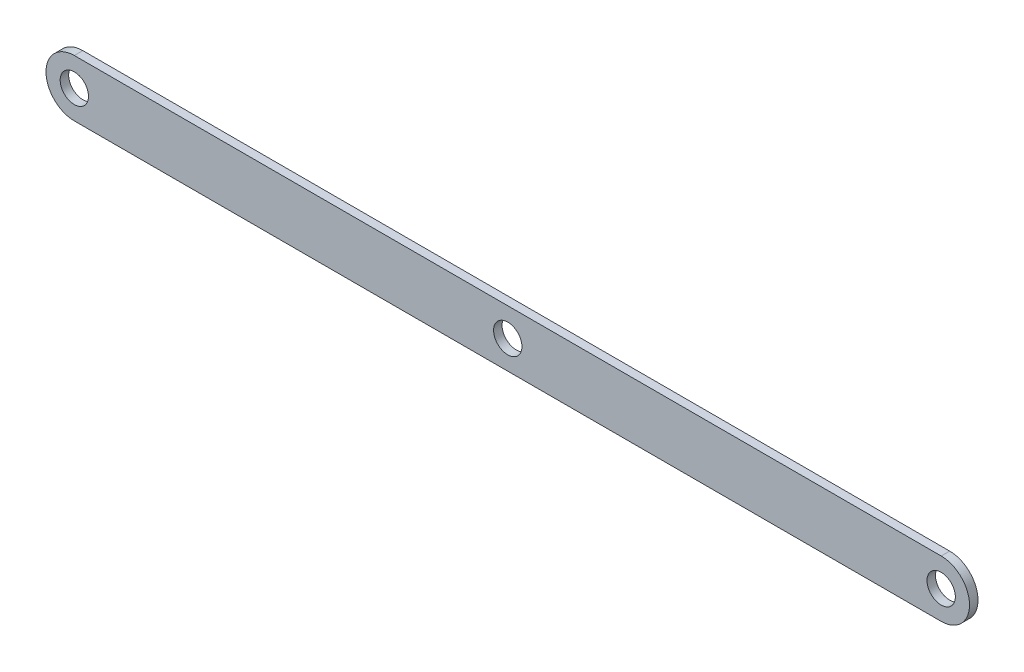
ISO-10303-21;
HEADER;
FILE_DESCRIPTION(('STEP AP214'),'2;1');
FILE_NAME('part.step','',(''),(''),'','','');
FILE_SCHEMA(('AUTOMOTIVE_DESIGN { 1 0 10303 214 1 1 1 1 }'));
ENDSEC;
DATA;
#1=APPLICATION_CONTEXT('core data for automotive mechanical design processes');
#2=APPLICATION_PROTOCOL_DEFINITION('international standard','automotive_design',2000,#1);
#3=PRODUCT_CONTEXT('',#1,'mechanical');
#4=PRODUCT('Part','Part','',(#3));
#5=PRODUCT_RELATED_PRODUCT_CATEGORY('part','',(#4));
#6=PRODUCT_DEFINITION_FORMATION('','',#4);
#7=PRODUCT_DEFINITION_CONTEXT('part definition',#1,'design');
#8=PRODUCT_DEFINITION('design','',#6,#7);
#9=PRODUCT_DEFINITION_SHAPE('','',#8);
#10=(LENGTH_UNIT() NAMED_UNIT(*) SI_UNIT(.MILLI.,.METRE.));
#11=(NAMED_UNIT(*) PLANE_ANGLE_UNIT() SI_UNIT($,.RADIAN.));
#12=(NAMED_UNIT(*) SI_UNIT($,.STERADIAN.) SOLID_ANGLE_UNIT());
#13=UNCERTAINTY_MEASURE_WITH_UNIT(LENGTH_MEASURE(1.E-05),#10,'distance_accuracy_value','');
#14=(GEOMETRIC_REPRESENTATION_CONTEXT(3) GLOBAL_UNCERTAINTY_ASSIGNED_CONTEXT((#13)) GLOBAL_UNIT_ASSIGNED_CONTEXT((#10,
#11,#12)) REPRESENTATION_CONTEXT('',''));
#15=CARTESIAN_POINT('',(0.,0.,0.));
#16=DIRECTION('',(0.,0.,1.));
#17=DIRECTION('',(1.,0.,0.));
#18=AXIS2_PLACEMENT_3D('',#15,#16,#17);
#19=CARTESIAN_POINT('',(0.,0.,1.5));
#20=DIRECTION('',(0.,0.,1.));
#21=DIRECTION('',(1.,0.,0.));
#22=AXIS2_PLACEMENT_3D('',#19,#20,#21);
#23=PLANE('',#22);
#24=CARTESIAN_POINT('',(153.,0.,1.5));
#25=DIRECTION('',(0.,0.,1.));
#26=DIRECTION('',(1.,0.,0.));
#27=AXIS2_PLACEMENT_3D('',#24,#25,#26);
#28=CIRCLE('',#27,2.5);
#29=CARTESIAN_POINT('',(155.5,0.,1.5));
#30=VERTEX_POINT('',#29);
#31=EDGE_CURVE('E134',#30,#30,#28,.T.);
#32=ORIENTED_EDGE('',*,*,#31,.F.);
#33=EDGE_LOOP('',(#32));
#34=FACE_BOUND('',#33,.T.);
#35=CARTESIAN_POINT('',(0.,0.,1.5));
#36=DIRECTION('',(0.,0.,1.));
#37=DIRECTION('',(1.,0.,0.));
#38=AXIS2_PLACEMENT_3D('',#35,#36,#37);
#39=CIRCLE('',#38,5.);
#40=CARTESIAN_POINT('',(0.,5.,1.5));
#41=VERTEX_POINT('',#40);
#42=CARTESIAN_POINT('',(0.,-5.,1.5));
#43=VERTEX_POINT('',#42);
#44=EDGE_CURVE('E92',#41,#43,#39,.T.);
#45=ORIENTED_EDGE('',*,*,#44,.T.);
#46=DIRECTION('',(1.,0.,0.));
#47=VECTOR('',#46,1.);
#48=CARTESIAN_POINT('',(0.,-5.,1.5));
#49=LINE('',#48,#47);
#50=CARTESIAN_POINT('',(153.,-5.,1.5));
#51=VERTEX_POINT('',#50);
#52=EDGE_CURVE('E87',#43,#51,#49,.T.);
#53=ORIENTED_EDGE('',*,*,#52,.T.);
#54=CARTESIAN_POINT('',(153.,0.,1.5));
#55=DIRECTION('',(0.,0.,1.));
#56=DIRECTION('',(1.,0.,0.));
#57=AXIS2_PLACEMENT_3D('',#54,#55,#56);
#58=CIRCLE('',#57,5.);
#59=CARTESIAN_POINT('',(153.,5.,1.5));
#60=VERTEX_POINT('',#59);
#61=EDGE_CURVE('E90',#51,#60,#58,.T.);
#62=ORIENTED_EDGE('',*,*,#61,.T.);
#63=DIRECTION('',(-1.,0.,0.));
#64=VECTOR('',#63,1.);
#65=CARTESIAN_POINT('',(0.,5.,1.5));
#66=LINE('',#65,#64);
#67=EDGE_CURVE('E57',#60,#41,#66,.T.);
#68=ORIENTED_EDGE('',*,*,#67,.T.);
#69=EDGE_LOOP('',(#45,#53,#62,#68));
#70=FACE_BOUND('',#69,.T.);
#71=CARTESIAN_POINT('',(0.,0.,1.5));
#72=DIRECTION('',(0.,0.,1.));
#73=DIRECTION('',(1.,0.,0.));
#74=AXIS2_PLACEMENT_3D('',#71,#72,#73);
#75=CIRCLE('',#74,2.5);
#76=CARTESIAN_POINT('',(2.5,0.,1.5));
#77=VERTEX_POINT('',#76);
#78=EDGE_CURVE('E112',#77,#77,#75,.T.);
#79=ORIENTED_EDGE('',*,*,#78,.F.);
#80=EDGE_LOOP('',(#79));
#81=FACE_BOUND('',#80,.T.);
#82=CARTESIAN_POINT('',(76.5,0.,1.5));
#83=DIRECTION('',(0.,0.,1.));
#84=DIRECTION('',(1.,0.,0.));
#85=AXIS2_PLACEMENT_3D('',#82,#83,#84);
#86=CIRCLE('',#85,2.50000000000001);
#87=CARTESIAN_POINT('',(79.,0.,1.5));
#88=VERTEX_POINT('',#87);
#89=EDGE_CURVE('E142',#88,#88,#86,.T.);
#90=ORIENTED_EDGE('',*,*,#89,.F.);
#91=EDGE_LOOP('',(#90));
#92=FACE_BOUND('',#91,.T.);
#93=ADVANCED_FACE('F39',(#34,#70,#81,#92),#23,.T.);
#94=CARTESIAN_POINT('',(0.,0.,0.));
#95=DIRECTION('',(0.,0.,1.));
#96=DIRECTION('',(1.,0.,0.));
#97=AXIS2_PLACEMENT_3D('',#94,#95,#96);
#98=PLANE('',#97);
#99=CARTESIAN_POINT('',(0.,0.,0.));
#100=DIRECTION('',(0.,0.,1.));
#101=DIRECTION('',(1.,0.,0.));
#102=AXIS2_PLACEMENT_3D('',#99,#100,#101);
#103=CIRCLE('',#102,5.);
#104=CARTESIAN_POINT('',(0.,5.,0.));
#105=VERTEX_POINT('',#104);
#106=CARTESIAN_POINT('',(0.,-5.,0.));
#107=VERTEX_POINT('',#106);
#108=EDGE_CURVE('E108',#105,#107,#103,.T.);
#109=ORIENTED_EDGE('',*,*,#108,.F.);
#110=DIRECTION('',(-1.,0.,0.));
#111=VECTOR('',#110,1.);
#112=CARTESIAN_POINT('',(0.,5.,0.));
#113=LINE('',#112,#111);
#114=CARTESIAN_POINT('',(153.,5.,0.));
#115=VERTEX_POINT('',#114);
#116=EDGE_CURVE('E80',#115,#105,#113,.T.);
#117=ORIENTED_EDGE('',*,*,#116,.F.);
#118=CARTESIAN_POINT('',(153.,0.,0.));
#119=DIRECTION('',(0.,0.,1.));
#120=DIRECTION('',(1.,0.,0.));
#121=AXIS2_PLACEMENT_3D('',#118,#119,#120);
#122=CIRCLE('',#121,5.);
#123=CARTESIAN_POINT('',(153.,-5.,0.));
#124=VERTEX_POINT('',#123);
#125=EDGE_CURVE('E74',#124,#115,#122,.T.);
#126=ORIENTED_EDGE('',*,*,#125,.F.);
#127=DIRECTION('',(1.,0.,0.));
#128=VECTOR('',#127,1.);
#129=CARTESIAN_POINT('',(0.,-5.,0.));
#130=LINE('',#129,#128);
#131=EDGE_CURVE('E97',#107,#124,#130,.T.);
#132=ORIENTED_EDGE('',*,*,#131,.F.);
#133=EDGE_LOOP('',(#109,#117,#126,#132));
#134=FACE_BOUND('',#133,.T.);
#135=CARTESIAN_POINT('',(0.,0.,0.));
#136=DIRECTION('',(0.,0.,1.));
#137=DIRECTION('',(1.,0.,0.));
#138=AXIS2_PLACEMENT_3D('',#135,#136,#137);
#139=CIRCLE('',#138,2.5);
#140=CARTESIAN_POINT('',(2.5,0.,0.));
#141=VERTEX_POINT('',#140);
#142=EDGE_CURVE('E130',#141,#141,#139,.T.);
#143=ORIENTED_EDGE('',*,*,#142,.T.);
#144=EDGE_LOOP('',(#143));
#145=FACE_BOUND('',#144,.T.);
#146=CARTESIAN_POINT('',(153.,0.,0.));
#147=DIRECTION('',(0.,0.,1.));
#148=DIRECTION('',(1.,0.,0.));
#149=AXIS2_PLACEMENT_3D('',#146,#147,#148);
#150=CIRCLE('',#149,2.5);
#151=CARTESIAN_POINT('',(155.5,0.,0.));
#152=VERTEX_POINT('',#151);
#153=EDGE_CURVE('E138',#152,#152,#150,.T.);
#154=ORIENTED_EDGE('',*,*,#153,.T.);
#155=EDGE_LOOP('',(#154));
#156=FACE_BOUND('',#155,.T.);
#157=CARTESIAN_POINT('',(76.5,0.,0.));
#158=DIRECTION('',(0.,0.,1.));
#159=DIRECTION('',(1.,0.,0.));
#160=AXIS2_PLACEMENT_3D('',#157,#158,#159);
#161=CIRCLE('',#160,2.50000000000001);
#162=CARTESIAN_POINT('',(79.,0.,0.));
#163=VERTEX_POINT('',#162);
#164=EDGE_CURVE('E146',#163,#163,#161,.T.);
#165=ORIENTED_EDGE('',*,*,#164,.T.);
#166=EDGE_LOOP('',(#165));
#167=FACE_BOUND('',#166,.T.);
#168=ADVANCED_FACE('F125',(#134,#145,#156,#167),#98,.F.);
#169=CARTESIAN_POINT('',(0.,0.,1.5));
#170=DIRECTION('',(0.,0.,-1.));
#171=DIRECTION('',(-1.,0.,0.));
#172=AXIS2_PLACEMENT_3D('',#169,#170,#171);
#173=CYLINDRICAL_SURFACE('',#172,5.);
#174=ORIENTED_EDGE('',*,*,#108,.T.);
#175=DIRECTION('',(0.,0.,-1.));
#176=VECTOR('',#175,1.);
#177=CARTESIAN_POINT('',(0.,-5.,1.5));
#178=LINE('',#177,#176);
#179=EDGE_CURVE('E11',#43,#107,#178,.T.);
#180=ORIENTED_EDGE('',*,*,#179,.F.);
#181=ORIENTED_EDGE('',*,*,#44,.F.);
#182=DIRECTION('',(0.,0.,-1.));
#183=VECTOR('',#182,1.);
#184=CARTESIAN_POINT('',(0.,5.,1.5));
#185=LINE('',#184,#183);
#186=EDGE_CURVE('E104',#41,#105,#185,.T.);
#187=ORIENTED_EDGE('',*,*,#186,.T.);
#188=EDGE_LOOP('',(#174,#180,#181,#187));
#189=FACE_BOUND('',#188,.T.);
#190=ADVANCED_FACE('F41',(#189),#173,.T.);
#191=CARTESIAN_POINT('',(0.,-5.,1.5));
#192=DIRECTION('',(0.,1.,0.));
#193=DIRECTION('',(0.,0.,1.));
#194=AXIS2_PLACEMENT_3D('',#191,#192,#193);
#195=PLANE('',#194);
#196=ORIENTED_EDGE('',*,*,#131,.T.);
#197=DIRECTION('',(0.,0.,-1.));
#198=VECTOR('',#197,1.);
#199=CARTESIAN_POINT('',(153.,-5.,1.5));
#200=LINE('',#199,#198);
#201=EDGE_CURVE('E49',#51,#124,#200,.T.);
#202=ORIENTED_EDGE('',*,*,#201,.F.);
#203=ORIENTED_EDGE('',*,*,#52,.F.);
#204=ORIENTED_EDGE('',*,*,#179,.T.);
#205=EDGE_LOOP('',(#196,#202,#203,#204));
#206=FACE_BOUND('',#205,.T.);
#207=ADVANCED_FACE('F96',(#206),#195,.F.);
#208=CARTESIAN_POINT('',(153.,0.,1.5));
#209=DIRECTION('',(0.,0.,-1.));
#210=DIRECTION('',(-1.,0.,0.));
#211=AXIS2_PLACEMENT_3D('',#208,#209,#210);
#212=CYLINDRICAL_SURFACE('',#211,5.);
#213=ORIENTED_EDGE('',*,*,#125,.T.);
#214=DIRECTION('',(0.,0.,-1.));
#215=VECTOR('',#214,1.);
#216=CARTESIAN_POINT('',(153.,5.,1.5));
#217=LINE('',#216,#215);
#218=EDGE_CURVE('E99',#60,#115,#217,.T.);
#219=ORIENTED_EDGE('',*,*,#218,.F.);
#220=ORIENTED_EDGE('',*,*,#61,.F.);
#221=ORIENTED_EDGE('',*,*,#201,.T.);
#222=EDGE_LOOP('',(#213,#219,#220,#221));
#223=FACE_BOUND('',#222,.T.);
#224=ADVANCED_FACE('F100',(#223),#212,.T.);
#225=CARTESIAN_POINT('',(0.,5.,1.5));
#226=DIRECTION('',(0.,-1.,0.));
#227=DIRECTION('',(0.,0.,-1.));
#228=AXIS2_PLACEMENT_3D('',#225,#226,#227);
#229=PLANE('',#228);
#230=ORIENTED_EDGE('',*,*,#116,.T.);
#231=ORIENTED_EDGE('',*,*,#186,.F.);
#232=ORIENTED_EDGE('',*,*,#67,.F.);
#233=ORIENTED_EDGE('',*,*,#218,.T.);
#234=EDGE_LOOP('',(#230,#231,#232,#233));
#235=FACE_BOUND('',#234,.T.);
#236=ADVANCED_FACE('F122',(#235),#229,.F.);
#237=CARTESIAN_POINT('',(0.,0.,1.5));
#238=DIRECTION('',(0.,0.,-1.));
#239=DIRECTION('',(-1.,0.,0.));
#240=AXIS2_PLACEMENT_3D('',#237,#238,#239);
#241=CYLINDRICAL_SURFACE('',#240,2.5);
#242=ORIENTED_EDGE('',*,*,#78,.T.);
#243=EDGE_LOOP('',(#242));
#244=FACE_BOUND('',#243,.T.);
#245=ORIENTED_EDGE('',*,*,#142,.F.);
#246=EDGE_LOOP('',(#245));
#247=FACE_BOUND('',#246,.T.);
#248=ADVANCED_FACE('F166',(#244,#247),#241,.F.);
#249=CARTESIAN_POINT('',(153.,0.,1.5));
#250=DIRECTION('',(0.,0.,-1.));
#251=DIRECTION('',(-1.,0.,0.));
#252=AXIS2_PLACEMENT_3D('',#249,#250,#251);
#253=CYLINDRICAL_SURFACE('',#252,2.5);
#254=ORIENTED_EDGE('',*,*,#31,.T.);
#255=EDGE_LOOP('',(#254));
#256=FACE_BOUND('',#255,.T.);
#257=ORIENTED_EDGE('',*,*,#153,.F.);
#258=EDGE_LOOP('',(#257));
#259=FACE_BOUND('',#258,.T.);
#260=ADVANCED_FACE('F212',(#256,#259),#253,.F.);
#261=CARTESIAN_POINT('',(76.5,0.,1.5));
#262=DIRECTION('',(0.,0.,-1.));
#263=DIRECTION('',(-1.,0.,0.));
#264=AXIS2_PLACEMENT_3D('',#261,#262,#263);
#265=CYLINDRICAL_SURFACE('',#264,2.50000000000001);
#266=ORIENTED_EDGE('',*,*,#89,.T.);
#267=EDGE_LOOP('',(#266));
#268=FACE_BOUND('',#267,.T.);
#269=ORIENTED_EDGE('',*,*,#164,.F.);
#270=EDGE_LOOP('',(#269));
#271=FACE_BOUND('',#270,.T.);
#272=ADVANCED_FACE('F154',(#268,#271),#265,.F.);
#273=CLOSED_SHELL('',(#93,#168,#190,#207,#224,#236,#248,#260,#272));
#274=MANIFOLD_SOLID_BREP('B2',#273);
#275=ADVANCED_BREP_SHAPE_REPRESENTATION('',(#18,#274),#14);
#276=SHAPE_DEFINITION_REPRESENTATION(#9,#275);
ENDSEC;
END-ISO-10303-21;
